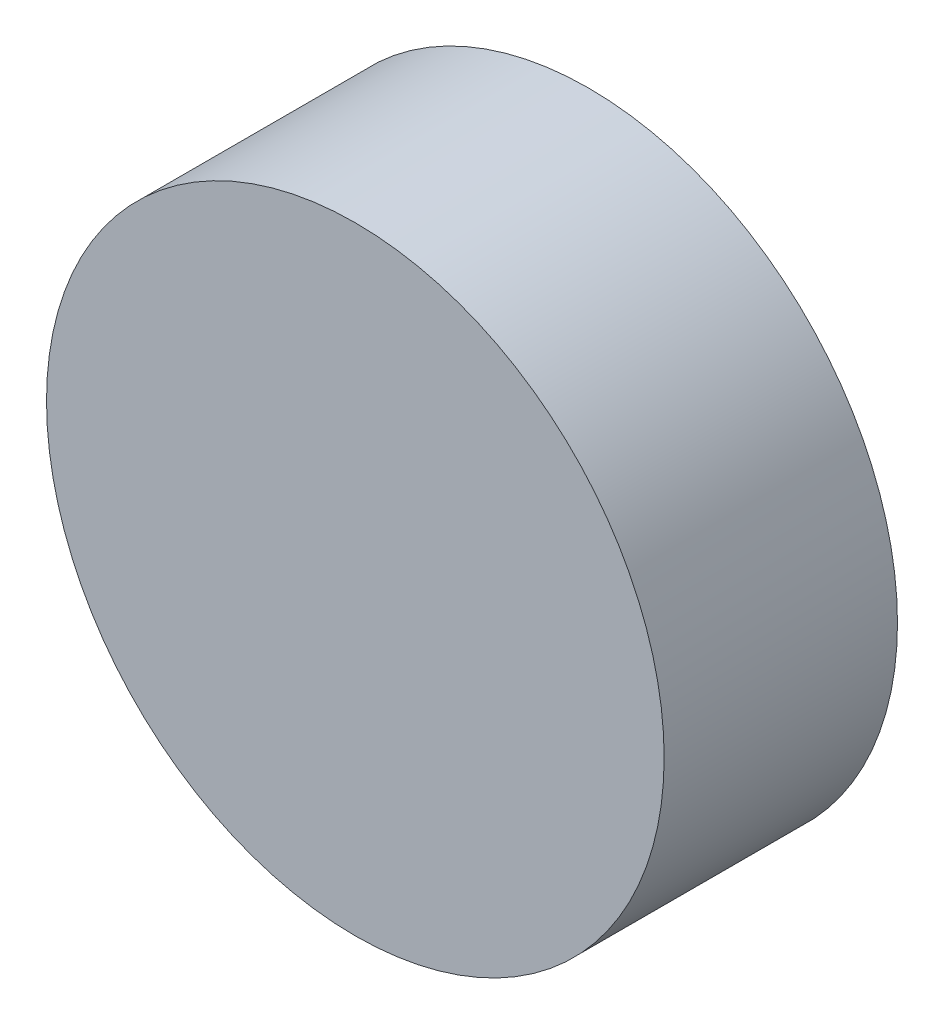
ISO-10303-21;
HEADER;
FILE_DESCRIPTION(('STEP AP214'),'2;1');
FILE_NAME('part.step','',(''),(''),'','','');
FILE_SCHEMA(('AUTOMOTIVE_DESIGN { 1 0 10303 214 1 1 1 1 }'));
ENDSEC;
DATA;
#1=APPLICATION_CONTEXT('core data for automotive mechanical design processes');
#2=APPLICATION_PROTOCOL_DEFINITION('international standard','automotive_design',2000,#1);
#3=PRODUCT_CONTEXT('',#1,'mechanical');
#4=PRODUCT('Part','Part','',(#3));
#5=PRODUCT_RELATED_PRODUCT_CATEGORY('part','',(#4));
#6=PRODUCT_DEFINITION_FORMATION('','',#4);
#7=PRODUCT_DEFINITION_CONTEXT('part definition',#1,'design');
#8=PRODUCT_DEFINITION('design','',#6,#7);
#9=PRODUCT_DEFINITION_SHAPE('','',#8);
#10=(LENGTH_UNIT() NAMED_UNIT(*) SI_UNIT(.MILLI.,.METRE.));
#11=(NAMED_UNIT(*) PLANE_ANGLE_UNIT() SI_UNIT($,.RADIAN.));
#12=(NAMED_UNIT(*) SI_UNIT($,.STERADIAN.) SOLID_ANGLE_UNIT());
#13=UNCERTAINTY_MEASURE_WITH_UNIT(LENGTH_MEASURE(1.E-05),#10,'distance_accuracy_value','');
#14=(GEOMETRIC_REPRESENTATION_CONTEXT(3) GLOBAL_UNCERTAINTY_ASSIGNED_CONTEXT((#13)) GLOBAL_UNIT_ASSIGNED_CONTEXT((#10,
#11,#12)) REPRESENTATION_CONTEXT('',''));
#15=CARTESIAN_POINT('',(0.,0.,0.));
#16=DIRECTION('',(0.,0.,1.));
#17=DIRECTION('',(1.,0.,0.));
#18=AXIS2_PLACEMENT_3D('',#15,#16,#17);
#19=CARTESIAN_POINT('',(0.,0.,1.7));
#20=DIRECTION('',(0.,0.,-1.));
#21=DIRECTION('',(-1.,0.,0.));
#22=AXIS2_PLACEMENT_3D('',#19,#20,#21);
#23=CYLINDRICAL_SURFACE('',#22,2.25);
#24=CARTESIAN_POINT('',(0.,0.,1.7));
#25=DIRECTION('',(0.,0.,1.));
#26=DIRECTION('',(1.,0.,0.));
#27=AXIS2_PLACEMENT_3D('',#24,#25,#26);
#28=CIRCLE('',#27,2.25);
#29=CARTESIAN_POINT('',(2.25,0.,1.7));
#30=VERTEX_POINT('',#29);
#31=EDGE_CURVE('E10',#30,#30,#28,.T.);
#32=ORIENTED_EDGE('',*,*,#31,.F.);
#33=EDGE_LOOP('',(#32));
#34=FACE_BOUND('',#33,.T.);
#35=CARTESIAN_POINT('',(0.,0.,0.));
#36=DIRECTION('',(0.,0.,1.));
#37=DIRECTION('',(1.,0.,0.));
#38=AXIS2_PLACEMENT_3D('',#35,#36,#37);
#39=CIRCLE('',#38,2.25);
#40=CARTESIAN_POINT('',(2.25,0.,0.));
#41=VERTEX_POINT('',#40);
#42=EDGE_CURVE('E33',#41,#41,#39,.T.);
#43=ORIENTED_EDGE('',*,*,#42,.T.);
#44=EDGE_LOOP('',(#43));
#45=FACE_BOUND('',#44,.T.);
#46=ADVANCED_FACE('F30',(#34,#45),#23,.T.);
#47=CARTESIAN_POINT('',(0.,0.,1.7));
#48=DIRECTION('',(0.,0.,1.));
#49=DIRECTION('',(1.,0.,0.));
#50=AXIS2_PLACEMENT_3D('',#47,#48,#49);
#51=PLANE('',#50);
#52=ORIENTED_EDGE('',*,*,#31,.T.);
#53=EDGE_LOOP('',(#52));
#54=FACE_BOUND('',#53,.T.);
#55=ADVANCED_FACE('F45',(#54),#51,.T.);
#56=CARTESIAN_POINT('',(0.,0.,0.));
#57=DIRECTION('',(0.,0.,1.));
#58=DIRECTION('',(1.,0.,0.));
#59=AXIS2_PLACEMENT_3D('',#56,#57,#58);
#60=PLANE('',#59);
#61=ORIENTED_EDGE('',*,*,#42,.F.);
#62=EDGE_LOOP('',(#61));
#63=FACE_BOUND('',#62,.T.);
#64=ADVANCED_FACE('F43',(#63),#60,.F.);
#65=CLOSED_SHELL('',(#46,#55,#64));
#66=MANIFOLD_SOLID_BREP('B2',#65);
#67=ADVANCED_BREP_SHAPE_REPRESENTATION('',(#18,#66),#14);
#68=SHAPE_DEFINITION_REPRESENTATION(#9,#67);
ENDSEC;
END-ISO-10303-21;
